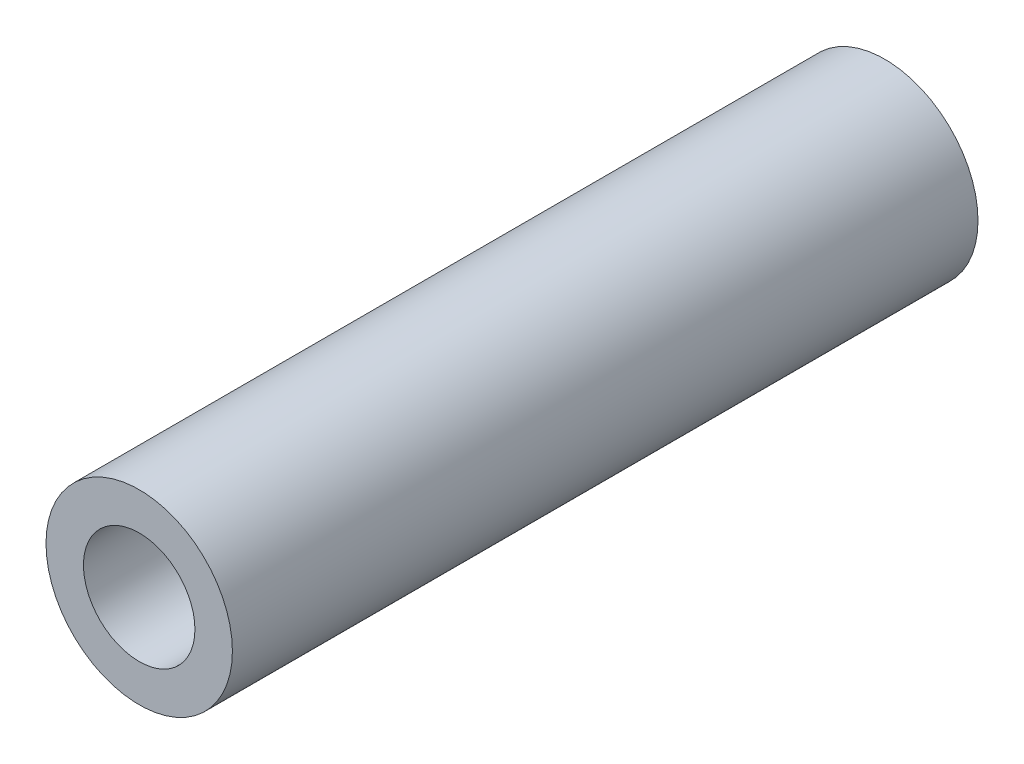
ISO-10303-21;
HEADER;
FILE_DESCRIPTION(('STEP AP214'),'2;1');
FILE_NAME('part.step','',(''),(''),'','','');
FILE_SCHEMA(('AUTOMOTIVE_DESIGN { 1 0 10303 214 1 1 1 1 }'));
ENDSEC;
DATA;
#1=APPLICATION_CONTEXT('core data for automotive mechanical design processes');
#2=APPLICATION_PROTOCOL_DEFINITION('international standard','automotive_design',2000,#1);
#3=PRODUCT_CONTEXT('',#1,'mechanical');
#4=PRODUCT('Part','Part','',(#3));
#5=PRODUCT_RELATED_PRODUCT_CATEGORY('part','',(#4));
#6=PRODUCT_DEFINITION_FORMATION('','',#4);
#7=PRODUCT_DEFINITION_CONTEXT('part definition',#1,'design');
#8=PRODUCT_DEFINITION('design','',#6,#7);
#9=PRODUCT_DEFINITION_SHAPE('','',#8);
#10=(LENGTH_UNIT() NAMED_UNIT(*) SI_UNIT(.MILLI.,.METRE.));
#11=(NAMED_UNIT(*) PLANE_ANGLE_UNIT() SI_UNIT($,.RADIAN.));
#12=(NAMED_UNIT(*) SI_UNIT($,.STERADIAN.) SOLID_ANGLE_UNIT());
#13=UNCERTAINTY_MEASURE_WITH_UNIT(LENGTH_MEASURE(1.E-05),#10,'distance_accuracy_value','');
#14=(GEOMETRIC_REPRESENTATION_CONTEXT(3) GLOBAL_UNCERTAINTY_ASSIGNED_CONTEXT((#13)) GLOBAL_UNIT_ASSIGNED_CONTEXT((#10,
#11,#12)) REPRESENTATION_CONTEXT('',''));
#15=CARTESIAN_POINT('',(0.,0.,0.));
#16=DIRECTION('',(0.,0.,1.));
#17=DIRECTION('',(1.,0.,0.));
#18=AXIS2_PLACEMENT_3D('',#15,#16,#17);
#19=CARTESIAN_POINT('',(0.,0.,-25.4));
#20=DIRECTION('',(0.,0.,1.));
#21=DIRECTION('',(1.,0.,0.));
#22=AXIS2_PLACEMENT_3D('',#19,#20,#21);
#23=CYLINDRICAL_SURFACE('',#22,3.175);
#24=CARTESIAN_POINT('',(0.,0.,-25.4));
#25=DIRECTION('',(0.,0.,1.));
#26=DIRECTION('',(1.,0.,0.));
#27=AXIS2_PLACEMENT_3D('',#24,#25,#26);
#28=CIRCLE('',#27,3.175);
#29=CARTESIAN_POINT('',(3.175,0.,-25.4));
#30=VERTEX_POINT('',#29);
#31=EDGE_CURVE('E10',#30,#30,#28,.T.);
#32=ORIENTED_EDGE('',*,*,#31,.T.);
#33=EDGE_LOOP('',(#32));
#34=FACE_BOUND('',#33,.T.);
#35=CARTESIAN_POINT('',(0.,0.,0.));
#36=DIRECTION('',(0.,0.,1.));
#37=DIRECTION('',(1.,0.,0.));
#38=AXIS2_PLACEMENT_3D('',#35,#36,#37);
#39=CIRCLE('',#38,3.175);
#40=CARTESIAN_POINT('',(3.175,0.,0.));
#41=VERTEX_POINT('',#40);
#42=EDGE_CURVE('E33',#41,#41,#39,.T.);
#43=ORIENTED_EDGE('',*,*,#42,.F.);
#44=EDGE_LOOP('',(#43));
#45=FACE_BOUND('',#44,.T.);
#46=ADVANCED_FACE('F30',(#34,#45),#23,.T.);
#47=CARTESIAN_POINT('',(0.,0.,-25.4));
#48=DIRECTION('',(0.,0.,1.));
#49=DIRECTION('',(1.,0.,0.));
#50=AXIS2_PLACEMENT_3D('',#47,#48,#49);
#51=PLANE('',#50);
#52=CARTESIAN_POINT('',(0.,0.,-25.4));
#53=DIRECTION('',(0.,0.,1.));
#54=DIRECTION('',(1.,0.,0.));
#55=AXIS2_PLACEMENT_3D('',#52,#53,#54);
#56=CIRCLE('',#55,1.89864999999999);
#57=CARTESIAN_POINT('',(1.89864999999999,0.,-25.4));
#58=VERTEX_POINT('',#57);
#59=EDGE_CURVE('E40',#58,#58,#56,.T.);
#60=ORIENTED_EDGE('',*,*,#59,.T.);
#61=EDGE_LOOP('',(#60));
#62=FACE_BOUND('',#61,.T.);
#63=ORIENTED_EDGE('',*,*,#31,.F.);
#64=EDGE_LOOP('',(#63));
#65=FACE_BOUND('',#64,.T.);
#66=ADVANCED_FACE('F53',(#62,#65),#51,.F.);
#67=CARTESIAN_POINT('',(0.,0.,0.));
#68=DIRECTION('',(0.,0.,1.));
#69=DIRECTION('',(1.,0.,0.));
#70=AXIS2_PLACEMENT_3D('',#67,#68,#69);
#71=PLANE('',#70);
#72=CARTESIAN_POINT('',(0.,0.,0.));
#73=DIRECTION('',(0.,0.,1.));
#74=DIRECTION('',(1.,0.,0.));
#75=AXIS2_PLACEMENT_3D('',#72,#73,#74);
#76=CIRCLE('',#75,1.89864999999999);
#77=CARTESIAN_POINT('',(1.89864999999999,0.,0.));
#78=VERTEX_POINT('',#77);
#79=EDGE_CURVE('E44',#78,#78,#76,.T.);
#80=ORIENTED_EDGE('',*,*,#79,.F.);
#81=EDGE_LOOP('',(#80));
#82=FACE_BOUND('',#81,.T.);
#83=ORIENTED_EDGE('',*,*,#42,.T.);
#84=EDGE_LOOP('',(#83));
#85=FACE_BOUND('',#84,.T.);
#86=ADVANCED_FACE('F50',(#82,#85),#71,.T.);
#87=CARTESIAN_POINT('',(0.,0.,0.));
#88=DIRECTION('',(0.,0.,1.));
#89=DIRECTION('',(1.,0.,0.));
#90=AXIS2_PLACEMENT_3D('',#87,#88,#89);
#91=CYLINDRICAL_SURFACE('',#90,1.89864999999999);
#92=ORIENTED_EDGE('',*,*,#59,.F.);
#93=EDGE_LOOP('',(#92));
#94=FACE_BOUND('',#93,.T.);
#95=ORIENTED_EDGE('',*,*,#79,.T.);
#96=EDGE_LOOP('',(#95));
#97=FACE_BOUND('',#96,.T.);
#98=ADVANCED_FACE('F48',(#94,#97),#91,.F.);
#99=CLOSED_SHELL('',(#46,#66,#86,#98));
#100=MANIFOLD_SOLID_BREP('B2',#99);
#101=ADVANCED_BREP_SHAPE_REPRESENTATION('',(#18,#100),#14);
#102=SHAPE_DEFINITION_REPRESENTATION(#9,#101);
ENDSEC;
END-ISO-10303-21;
